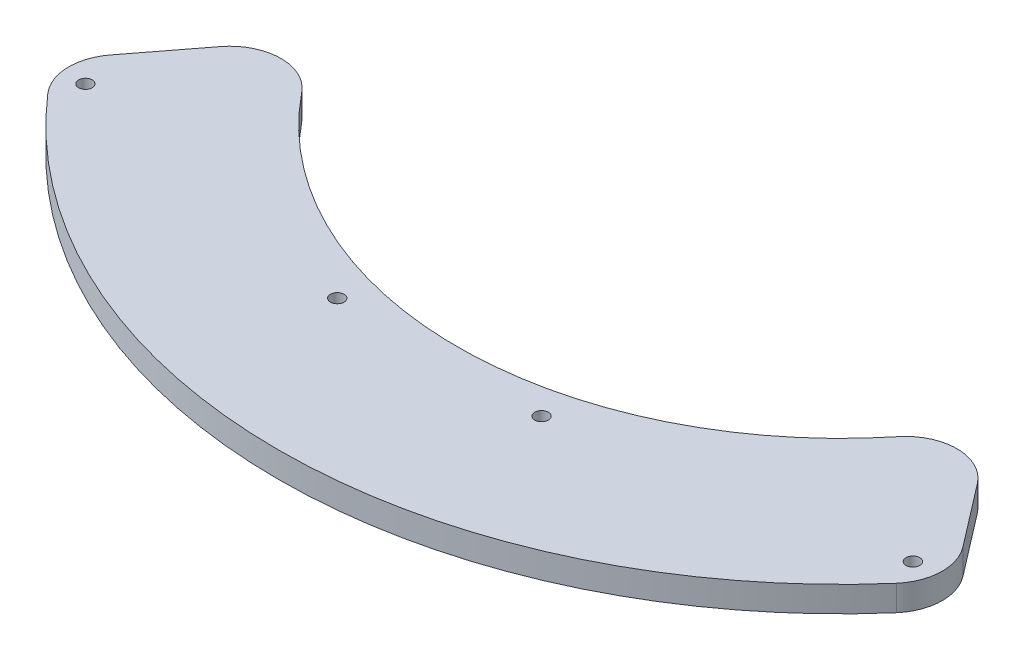
ISO-10303-21;
HEADER;
FILE_DESCRIPTION(('STEP AP214'),'2;1');
FILE_NAME('part.step','',(''),(''),'','','');
FILE_SCHEMA(('AUTOMOTIVE_DESIGN { 1 0 10303 214 1 1 1 1 }'));
ENDSEC;
DATA;
#1=APPLICATION_CONTEXT('core data for automotive mechanical design processes');
#2=APPLICATION_PROTOCOL_DEFINITION('international standard','automotive_design',2000,#1);
#3=PRODUCT_CONTEXT('',#1,'mechanical');
#4=PRODUCT('Part','Part','',(#3));
#5=PRODUCT_RELATED_PRODUCT_CATEGORY('part','',(#4));
#6=PRODUCT_DEFINITION_FORMATION('','',#4);
#7=PRODUCT_DEFINITION_CONTEXT('part definition',#1,'design');
#8=PRODUCT_DEFINITION('design','',#6,#7);
#9=PRODUCT_DEFINITION_SHAPE('','',#8);
#10=(LENGTH_UNIT() NAMED_UNIT(*) SI_UNIT(.MILLI.,.METRE.));
#11=(NAMED_UNIT(*) PLANE_ANGLE_UNIT() SI_UNIT($,.RADIAN.));
#12=(NAMED_UNIT(*) SI_UNIT($,.STERADIAN.) SOLID_ANGLE_UNIT());
#13=UNCERTAINTY_MEASURE_WITH_UNIT(LENGTH_MEASURE(1.E-05),#10,'distance_accuracy_value','');
#14=(GEOMETRIC_REPRESENTATION_CONTEXT(3) GLOBAL_UNCERTAINTY_ASSIGNED_CONTEXT((#13)) GLOBAL_UNIT_ASSIGNED_CONTEXT((#10,
#11,#12)) REPRESENTATION_CONTEXT('',''));
#15=CARTESIAN_POINT('',(0.,0.,0.));
#16=DIRECTION('',(0.,0.,1.));
#17=DIRECTION('',(1.,0.,0.));
#18=AXIS2_PLACEMENT_3D('',#15,#16,#17);
#19=CARTESIAN_POINT('',(84.021948487146,6.35,-34.47476750129));
#20=DIRECTION('',(0.,-1.,0.));
#21=DIRECTION('',(0.,0.,-1.));
#22=AXIS2_PLACEMENT_3D('',#19,#20,#21);
#23=PLANE('',#22);
#24=CARTESIAN_POINT('',(-102.87,6.35,-17.3975111104705));
#25=DIRECTION('',(0.,1.,0.));
#26=DIRECTION('',(0.,0.,-1.));
#27=AXIS2_PLACEMENT_3D('',#24,#25,#26);
#28=CIRCLE('',#27,1.70053000000001);
#29=CARTESIAN_POINT('',(-102.87,6.35,-19.0980411104705));
#30=VERTEX_POINT('',#29);
#31=EDGE_CURVE('E187',#30,#30,#28,.T.);
#32=ORIENTED_EDGE('',*,*,#31,.F.);
#33=EDGE_LOOP('',(#32));
#34=FACE_BOUND('',#33,.T.);
#35=CARTESIAN_POINT('',(102.87,6.35,-17.3975111104704));
#36=DIRECTION('',(0.,1.,0.));
#37=DIRECTION('',(0.,0.,1.));
#38=AXIS2_PLACEMENT_3D('',#35,#36,#37);
#39=CIRCLE('',#38,1.70053000000001);
#40=CARTESIAN_POINT('',(102.87,6.35,-15.6969811104704));
#41=VERTEX_POINT('',#40);
#42=EDGE_CURVE('E133',#41,#41,#39,.T.);
#43=ORIENTED_EDGE('',*,*,#42,.F.);
#44=EDGE_LOOP('',(#43));
#45=FACE_BOUND('',#44,.T.);
#46=CARTESIAN_POINT('',(84.021948487146,6.35,-34.47476750129));
#47=DIRECTION('',(0.,1.,0.));
#48=DIRECTION('',(0.,0.,-1.));
#49=AXIS2_PLACEMENT_3D('',#46,#47,#48);
#50=CIRCLE('',#49,12.7);
#51=CARTESIAN_POINT('',(94.0975359088447,6.35,-42.2060376497007));
#52=VERTEX_POINT('',#51);
#53=CARTESIAN_POINT('',(74.1370133710112,6.35,-42.4483525011382));
#54=VERTEX_POINT('',#53);
#55=EDGE_CURVE('E144',#52,#54,#50,.T.);
#56=ORIENTED_EDGE('',*,*,#55,.T.);
#57=CARTESIAN_POINT('',(0.,6.35,-102.25024));
#58=DIRECTION('',(0.,-1.,0.));
#59=DIRECTION('',(0.,0.,1.));
#60=AXIS2_PLACEMENT_3D('',#57,#58,#59);
#61=CIRCLE('',#60,95.25);
#62=CARTESIAN_POINT('',(-74.1370133710112,6.35,-42.4483525011384));
#63=VERTEX_POINT('',#62);
#64=EDGE_CURVE('E92',#54,#63,#61,.T.);
#65=ORIENTED_EDGE('',*,*,#64,.T.);
#66=CARTESIAN_POINT('',(-84.021948487146,6.35,-34.4747675012901));
#67=DIRECTION('',(0.,1.,0.));
#68=DIRECTION('',(0.,0.,1.));
#69=AXIS2_PLACEMENT_3D('',#66,#67,#68);
#70=CIRCLE('',#69,12.7);
#71=CARTESIAN_POINT('',(-94.0975359088447,6.35,-42.2060376497008));
#72=VERTEX_POINT('',#71);
#73=EDGE_CURVE('E159',#63,#72,#70,.T.);
#74=ORIENTED_EDGE('',*,*,#73,.T.);
#75=DIRECTION('',(-0.608761429008717,0.,0.793353340291238));
#76=VECTOR('',#75,1.);
#77=CARTESIAN_POINT('',(-105.977429973967,6.35,-26.7238582773672));
#78=LINE('',#77,#76);
#79=CARTESIAN_POINT('',(-105.977429973967,6.35,-26.7238582773672));
#80=VERTEX_POINT('',#79);
#81=EDGE_CURVE('E172',#72,#80,#78,.T.);
#82=ORIENTED_EDGE('',*,*,#81,.T.);
#83=CARTESIAN_POINT('',(-95.9018425522686,6.35,-18.9925881289565));
#84=DIRECTION('',(0.,1.,0.));
#85=DIRECTION('',(0.,0.,1.));
#86=AXIS2_PLACEMENT_3D('',#83,#84,#85);
#87=CIRCLE('',#86,12.7);
#88=CARTESIAN_POINT('',(-105.492026807495,6.35,-10.6668229418522));
#89=VERTEX_POINT('',#88);
#90=EDGE_CURVE('E111',#80,#89,#87,.T.);
#91=ORIENTED_EDGE('',*,*,#90,.T.);
#92=CARTESIAN_POINT('',(0.,6.35,-102.25024));
#93=DIRECTION('',(0.,1.,0.));
#94=DIRECTION('',(0.,0.,1.));
#95=AXIS2_PLACEMENT_3D('',#92,#93,#94);
#96=CIRCLE('',#95,139.7);
#97=CARTESIAN_POINT('',(105.492026807495,6.35,-10.666822941852));
#98=VERTEX_POINT('',#97);
#99=EDGE_CURVE('E105',#89,#98,#96,.T.);
#100=ORIENTED_EDGE('',*,*,#99,.T.);
#101=CARTESIAN_POINT('',(95.9018425522686,6.35,-18.9925881289563));
#102=DIRECTION('',(0.,1.,0.));
#103=DIRECTION('',(0.,0.,-1.));
#104=AXIS2_PLACEMENT_3D('',#101,#102,#103);
#105=CIRCLE('',#104,12.7);
#106=CARTESIAN_POINT('',(105.977429973967,6.35,-26.723858277367));
#107=VERTEX_POINT('',#106);
#108=EDGE_CURVE('E109',#98,#107,#105,.T.);
#109=ORIENTED_EDGE('',*,*,#108,.T.);
#110=DIRECTION('',(-0.608761429008716,0.,-0.793353340291238));
#111=VECTOR('',#110,1.);
#112=CARTESIAN_POINT('',(94.0975359088447,6.35,-42.2060376497007));
#113=LINE('',#112,#111);
#114=EDGE_CURVE('E49',#107,#52,#113,.T.);
#115=ORIENTED_EDGE('',*,*,#114,.T.);
#116=EDGE_LOOP('',(#56,#65,#74,#82,#91,#100,#109,#115));
#117=FACE_BOUND('',#116,.T.);
#118=CARTESIAN_POINT('',(25.4,6.35,-2.54));
#119=DIRECTION('',(0.,1.,0.));
#120=DIRECTION('',(0.,0.,1.));
#121=AXIS2_PLACEMENT_3D('',#118,#119,#120);
#122=CIRCLE('',#121,1.70053);
#123=CARTESIAN_POINT('',(25.4,6.35,-0.839469999999998));
#124=VERTEX_POINT('',#123);
#125=EDGE_CURVE('E181',#124,#124,#122,.T.);
#126=ORIENTED_EDGE('',*,*,#125,.F.);
#127=EDGE_LOOP('',(#126));
#128=FACE_BOUND('',#127,.T.);
#129=CARTESIAN_POINT('',(-25.4,6.35,-2.54000000000003));
#130=DIRECTION('',(0.,1.,0.));
#131=DIRECTION('',(0.,0.,-1.));
#132=AXIS2_PLACEMENT_3D('',#129,#130,#131);
#133=CIRCLE('',#132,1.70053);
#134=CARTESIAN_POINT('',(-25.4,6.35,-4.24053000000003));
#135=VERTEX_POINT('',#134);
#136=EDGE_CURVE('E193',#135,#135,#133,.T.);
#137=ORIENTED_EDGE('',*,*,#136,.F.);
#138=EDGE_LOOP('',(#137));
#139=FACE_BOUND('',#138,.T.);
#140=ADVANCED_FACE('F32',(#34,#45,#117,#128,#139),#23,.F.);
#141=CARTESIAN_POINT('',(84.021948487146,0.,-34.47476750129));
#142=DIRECTION('',(0.,-1.,0.));
#143=DIRECTION('',(0.,0.,-1.));
#144=AXIS2_PLACEMENT_3D('',#141,#142,#143);
#145=PLANE('',#144);
#146=CARTESIAN_POINT('',(-102.87,0.,-17.3975111104705));
#147=DIRECTION('',(0.,1.,0.));
#148=DIRECTION('',(0.,0.,-1.));
#149=AXIS2_PLACEMENT_3D('',#146,#147,#148);
#150=CIRCLE('',#149,1.70053000000001);
#151=CARTESIAN_POINT('',(-102.87,0.,-19.0980411104705));
#152=VERTEX_POINT('',#151);
#153=EDGE_CURVE('E190',#152,#152,#150,.T.);
#154=ORIENTED_EDGE('',*,*,#153,.T.);
#155=EDGE_LOOP('',(#154));
#156=FACE_BOUND('',#155,.T.);
#157=CARTESIAN_POINT('',(102.87,0.,-17.3975111104704));
#158=DIRECTION('',(0.,1.,0.));
#159=DIRECTION('',(0.,0.,1.));
#160=AXIS2_PLACEMENT_3D('',#157,#158,#159);
#161=CIRCLE('',#160,1.70053000000001);
#162=CARTESIAN_POINT('',(102.87,0.,-15.6969811104704));
#163=VERTEX_POINT('',#162);
#164=EDGE_CURVE('E178',#163,#163,#161,.T.);
#165=ORIENTED_EDGE('',*,*,#164,.T.);
#166=EDGE_LOOP('',(#165));
#167=FACE_BOUND('',#166,.T.);
#168=CARTESIAN_POINT('',(84.021948487146,0.,-34.47476750129));
#169=DIRECTION('',(0.,1.,0.));
#170=DIRECTION('',(0.,0.,-1.));
#171=AXIS2_PLACEMENT_3D('',#168,#169,#170);
#172=CIRCLE('',#171,12.7);
#173=CARTESIAN_POINT('',(94.0975359088447,0.,-42.2060376497007));
#174=VERTEX_POINT('',#173);
#175=CARTESIAN_POINT('',(74.1370133710112,0.,-42.4483525011382));
#176=VERTEX_POINT('',#175);
#177=EDGE_CURVE('E129',#174,#176,#172,.T.);
#178=ORIENTED_EDGE('',*,*,#177,.F.);
#179=DIRECTION('',(-0.608761429008716,0.,-0.793353340291238));
#180=VECTOR('',#179,1.);
#181=CARTESIAN_POINT('',(94.0975359088447,0.,-42.2060376497007));
#182=LINE('',#181,#180);
#183=CARTESIAN_POINT('',(105.977429973967,0.,-26.723858277367));
#184=VERTEX_POINT('',#183);
#185=EDGE_CURVE('E84',#184,#174,#182,.T.);
#186=ORIENTED_EDGE('',*,*,#185,.F.);
#187=CARTESIAN_POINT('',(95.9018425522686,0.,-18.9925881289563));
#188=DIRECTION('',(0.,1.,0.));
#189=DIRECTION('',(0.,0.,-1.));
#190=AXIS2_PLACEMENT_3D('',#187,#188,#189);
#191=CIRCLE('',#190,12.7);
#192=CARTESIAN_POINT('',(105.492026807495,0.,-10.666822941852));
#193=VERTEX_POINT('',#192);
#194=EDGE_CURVE('E78',#193,#184,#191,.T.);
#195=ORIENTED_EDGE('',*,*,#194,.F.);
#196=CARTESIAN_POINT('',(0.,0.,-102.25024));
#197=DIRECTION('',(0.,1.,0.));
#198=DIRECTION('',(0.,0.,1.));
#199=AXIS2_PLACEMENT_3D('',#196,#197,#198);
#200=CIRCLE('',#199,139.7);
#201=CARTESIAN_POINT('',(-105.492026807495,0.,-10.6668229418522));
#202=VERTEX_POINT('',#201);
#203=EDGE_CURVE('E119',#202,#193,#200,.T.);
#204=ORIENTED_EDGE('',*,*,#203,.F.);
#205=CARTESIAN_POINT('',(-95.9018425522686,0.,-18.9925881289565));
#206=DIRECTION('',(0.,1.,0.));
#207=DIRECTION('',(0.,0.,1.));
#208=AXIS2_PLACEMENT_3D('',#205,#206,#207);
#209=CIRCLE('',#208,12.7);
#210=CARTESIAN_POINT('',(-105.977429973967,0.,-26.7238582773672));
#211=VERTEX_POINT('',#210);
#212=EDGE_CURVE('E139',#211,#202,#209,.T.);
#213=ORIENTED_EDGE('',*,*,#212,.F.);
#214=DIRECTION('',(-0.608761429008717,0.,0.793353340291238));
#215=VECTOR('',#214,1.);
#216=CARTESIAN_POINT('',(-105.977429973967,0.,-26.7238582773672));
#217=LINE('',#216,#215);
#218=CARTESIAN_POINT('',(-94.0975359088447,0.,-42.2060376497008));
#219=VERTEX_POINT('',#218);
#220=EDGE_CURVE('E137',#219,#211,#217,.T.);
#221=ORIENTED_EDGE('',*,*,#220,.F.);
#222=CARTESIAN_POINT('',(-84.021948487146,0.,-34.4747675012901));
#223=DIRECTION('',(0.,1.,0.));
#224=DIRECTION('',(0.,0.,1.));
#225=AXIS2_PLACEMENT_3D('',#222,#223,#224);
#226=CIRCLE('',#225,12.7);
#227=CARTESIAN_POINT('',(-74.1370133710112,0.,-42.4483525011384));
#228=VERTEX_POINT('',#227);
#229=EDGE_CURVE('E135',#228,#219,#226,.T.);
#230=ORIENTED_EDGE('',*,*,#229,.F.);
#231=CARTESIAN_POINT('',(0.,0.,-102.25024));
#232=DIRECTION('',(0.,-1.,0.));
#233=DIRECTION('',(0.,0.,1.));
#234=AXIS2_PLACEMENT_3D('',#231,#232,#233);
#235=CIRCLE('',#234,95.25);
#236=EDGE_CURVE('E132',#176,#228,#235,.T.);
#237=ORIENTED_EDGE('',*,*,#236,.F.);
#238=EDGE_LOOP('',(#178,#186,#195,#204,#213,#221,#230,#237));
#239=FACE_BOUND('',#238,.T.);
#240=CARTESIAN_POINT('',(25.4,0.,-2.54));
#241=DIRECTION('',(0.,1.,0.));
#242=DIRECTION('',(0.,0.,1.));
#243=AXIS2_PLACEMENT_3D('',#240,#241,#242);
#244=CIRCLE('',#243,1.70053);
#245=CARTESIAN_POINT('',(25.4,0.,-0.839469999999998));
#246=VERTEX_POINT('',#245);
#247=EDGE_CURVE('E184',#246,#246,#244,.T.);
#248=ORIENTED_EDGE('',*,*,#247,.T.);
#249=EDGE_LOOP('',(#248));
#250=FACE_BOUND('',#249,.T.);
#251=CARTESIAN_POINT('',(-25.4,0.,-2.54000000000003));
#252=DIRECTION('',(0.,1.,0.));
#253=DIRECTION('',(0.,0.,-1.));
#254=AXIS2_PLACEMENT_3D('',#251,#252,#253);
#255=CIRCLE('',#254,1.70053);
#256=CARTESIAN_POINT('',(-25.4,0.,-4.24053000000003));
#257=VERTEX_POINT('',#256);
#258=EDGE_CURVE('E196',#257,#257,#255,.T.);
#259=ORIENTED_EDGE('',*,*,#258,.T.);
#260=EDGE_LOOP('',(#259));
#261=FACE_BOUND('',#260,.T.);
#262=ADVANCED_FACE('F163',(#156,#167,#239,#250,#261),#145,.T.);
#263=CARTESIAN_POINT('',(84.021948487146,6.35,-34.47476750129));
#264=DIRECTION('',(0.,-1.,0.));
#265=DIRECTION('',(0.,0.,-1.));
#266=AXIS2_PLACEMENT_3D('',#263,#264,#265);
#267=CYLINDRICAL_SURFACE('',#266,12.7);
#268=ORIENTED_EDGE('',*,*,#177,.T.);
#269=DIRECTION('',(0.,-1.,0.));
#270=VECTOR('',#269,1.);
#271=CARTESIAN_POINT('',(74.1370133710112,6.35,-42.4483525011382));
#272=LINE('',#271,#270);
#273=EDGE_CURVE('E11',#54,#176,#272,.T.);
#274=ORIENTED_EDGE('',*,*,#273,.F.);
#275=ORIENTED_EDGE('',*,*,#55,.F.);
#276=DIRECTION('',(0.,-1.,0.));
#277=VECTOR('',#276,1.);
#278=CARTESIAN_POINT('',(94.0975359088447,6.35,-42.2060376497007));
#279=LINE('',#278,#277);
#280=EDGE_CURVE('E125',#52,#174,#279,.T.);
#281=ORIENTED_EDGE('',*,*,#280,.T.);
#282=EDGE_LOOP('',(#268,#274,#275,#281));
#283=FACE_BOUND('',#282,.T.);
#284=ADVANCED_FACE('F34',(#283),#267,.T.);
#285=CARTESIAN_POINT('',(0.,6.35,-102.25024));
#286=DIRECTION('',(0.,-1.,0.));
#287=DIRECTION('',(0.,0.,-1.));
#288=AXIS2_PLACEMENT_3D('',#285,#286,#287);
#289=CYLINDRICAL_SURFACE('',#288,95.25);
#290=ORIENTED_EDGE('',*,*,#236,.T.);
#291=DIRECTION('',(0.,-1.,0.));
#292=VECTOR('',#291,1.);
#293=CARTESIAN_POINT('',(-74.1370133710112,6.35,-42.4483525011384));
#294=LINE('',#293,#292);
#295=EDGE_CURVE('E41',#63,#228,#294,.T.);
#296=ORIENTED_EDGE('',*,*,#295,.F.);
#297=ORIENTED_EDGE('',*,*,#64,.F.);
#298=ORIENTED_EDGE('',*,*,#273,.T.);
#299=EDGE_LOOP('',(#290,#296,#297,#298));
#300=FACE_BOUND('',#299,.T.);
#301=ADVANCED_FACE('F231',(#300),#289,.F.);
#302=CARTESIAN_POINT('',(-84.021948487146,6.35,-34.4747675012901));
#303=DIRECTION('',(0.,-1.,0.));
#304=DIRECTION('',(0.,0.,-1.));
#305=AXIS2_PLACEMENT_3D('',#302,#303,#304);
#306=CYLINDRICAL_SURFACE('',#305,12.7);
#307=ORIENTED_EDGE('',*,*,#229,.T.);
#308=DIRECTION('',(0.,-1.,0.));
#309=VECTOR('',#308,1.);
#310=CARTESIAN_POINT('',(-94.0975359088447,6.35,-42.2060376497008));
#311=LINE('',#310,#309);
#312=EDGE_CURVE('E151',#72,#219,#311,.T.);
#313=ORIENTED_EDGE('',*,*,#312,.F.);
#314=ORIENTED_EDGE('',*,*,#73,.F.);
#315=ORIENTED_EDGE('',*,*,#295,.T.);
#316=EDGE_LOOP('',(#307,#313,#314,#315));
#317=FACE_BOUND('',#316,.T.);
#318=ADVANCED_FACE('F157',(#317),#306,.T.);
#319=CARTESIAN_POINT('',(-105.977429973967,6.35,-26.7238582773672));
#320=DIRECTION('',(0.793353340291238,0.,0.608761429008717));
#321=DIRECTION('',(0.608761429008717,0.,-0.793353340291238));
#322=AXIS2_PLACEMENT_3D('',#319,#320,#321);
#323=PLANE('',#322);
#324=ORIENTED_EDGE('',*,*,#220,.T.);
#325=DIRECTION('',(0.,-1.,0.));
#326=VECTOR('',#325,1.);
#327=CARTESIAN_POINT('',(-105.977429973967,6.35,-26.7238582773672));
#328=LINE('',#327,#326);
#329=EDGE_CURVE('E148',#80,#211,#328,.T.);
#330=ORIENTED_EDGE('',*,*,#329,.F.);
#331=ORIENTED_EDGE('',*,*,#81,.F.);
#332=ORIENTED_EDGE('',*,*,#312,.T.);
#333=EDGE_LOOP('',(#324,#330,#331,#332));
#334=FACE_BOUND('',#333,.T.);
#335=ADVANCED_FACE('F168',(#334),#323,.F.);
#336=CARTESIAN_POINT('',(-95.9018425522686,6.35,-18.9925881289565));
#337=DIRECTION('',(0.,-1.,0.));
#338=DIRECTION('',(0.,0.,-1.));
#339=AXIS2_PLACEMENT_3D('',#336,#337,#338);
#340=CYLINDRICAL_SURFACE('',#339,12.7);
#341=ORIENTED_EDGE('',*,*,#212,.T.);
#342=DIRECTION('',(0.,-1.,0.));
#343=VECTOR('',#342,1.);
#344=CARTESIAN_POINT('',(-105.492026807495,6.35,-10.6668229418522));
#345=LINE('',#344,#343);
#346=EDGE_CURVE('E120',#89,#202,#345,.T.);
#347=ORIENTED_EDGE('',*,*,#346,.F.);
#348=ORIENTED_EDGE('',*,*,#90,.F.);
#349=ORIENTED_EDGE('',*,*,#329,.T.);
#350=EDGE_LOOP('',(#341,#347,#348,#349));
#351=FACE_BOUND('',#350,.T.);
#352=ADVANCED_FACE('F171',(#351),#340,.T.);
#353=CARTESIAN_POINT('',(0.,6.35,-102.25024));
#354=DIRECTION('',(0.,-1.,0.));
#355=DIRECTION('',(0.,0.,-1.));
#356=AXIS2_PLACEMENT_3D('',#353,#354,#355);
#357=CYLINDRICAL_SURFACE('',#356,139.7);
#358=ORIENTED_EDGE('',*,*,#203,.T.);
#359=DIRECTION('',(0.,-1.,0.));
#360=VECTOR('',#359,1.);
#361=CARTESIAN_POINT('',(105.492026807495,6.35,-10.666822941852));
#362=LINE('',#361,#360);
#363=EDGE_CURVE('E116',#98,#193,#362,.T.);
#364=ORIENTED_EDGE('',*,*,#363,.F.);
#365=ORIENTED_EDGE('',*,*,#99,.F.);
#366=ORIENTED_EDGE('',*,*,#346,.T.);
#367=EDGE_LOOP('',(#358,#364,#365,#366));
#368=FACE_BOUND('',#367,.T.);
#369=ADVANCED_FACE('F117',(#368),#357,.T.);
#370=CARTESIAN_POINT('',(95.9018425522686,6.35,-18.9925881289563));
#371=DIRECTION('',(0.,-1.,0.));
#372=DIRECTION('',(0.,0.,-1.));
#373=AXIS2_PLACEMENT_3D('',#370,#371,#372);
#374=CYLINDRICAL_SURFACE('',#373,12.7);
#375=ORIENTED_EDGE('',*,*,#194,.T.);
#376=DIRECTION('',(0.,-1.,0.));
#377=VECTOR('',#376,1.);
#378=CARTESIAN_POINT('',(105.977429973967,6.35,-26.723858277367));
#379=LINE('',#378,#377);
#380=EDGE_CURVE('E121',#107,#184,#379,.T.);
#381=ORIENTED_EDGE('',*,*,#380,.F.);
#382=ORIENTED_EDGE('',*,*,#108,.F.);
#383=ORIENTED_EDGE('',*,*,#363,.T.);
#384=EDGE_LOOP('',(#375,#381,#382,#383));
#385=FACE_BOUND('',#384,.T.);
#386=ADVANCED_FACE('F123',(#385),#374,.T.);
#387=CARTESIAN_POINT('',(94.0975359088447,6.35,-42.2060376497007));
#388=DIRECTION('',(-0.793353340291238,0.,0.608761429008716));
#389=DIRECTION('',(0.608761429008716,0.,0.793353340291238));
#390=AXIS2_PLACEMENT_3D('',#387,#388,#389);
#391=PLANE('',#390);
#392=ORIENTED_EDGE('',*,*,#185,.T.);
#393=ORIENTED_EDGE('',*,*,#280,.F.);
#394=ORIENTED_EDGE('',*,*,#114,.F.);
#395=ORIENTED_EDGE('',*,*,#380,.T.);
#396=EDGE_LOOP('',(#392,#393,#394,#395));
#397=FACE_BOUND('',#396,.T.);
#398=ADVANCED_FACE('F219',(#397),#391,.F.);
#399=CARTESIAN_POINT('',(102.87,6.35,-17.3975111104704));
#400=DIRECTION('',(0.,-1.,0.));
#401=DIRECTION('',(0.,0.,-1.));
#402=AXIS2_PLACEMENT_3D('',#399,#400,#401);
#403=CYLINDRICAL_SURFACE('',#402,1.70053000000001);
#404=ORIENTED_EDGE('',*,*,#42,.T.);
#405=EDGE_LOOP('',(#404));
#406=FACE_BOUND('',#405,.T.);
#407=ORIENTED_EDGE('',*,*,#164,.F.);
#408=EDGE_LOOP('',(#407));
#409=FACE_BOUND('',#408,.T.);
#410=ADVANCED_FACE('F216',(#406,#409),#403,.F.);
#411=CARTESIAN_POINT('',(25.4,6.35,-2.54));
#412=DIRECTION('',(0.,-1.,0.));
#413=DIRECTION('',(0.,0.,-1.));
#414=AXIS2_PLACEMENT_3D('',#411,#412,#413);
#415=CYLINDRICAL_SURFACE('',#414,1.70053);
#416=ORIENTED_EDGE('',*,*,#125,.T.);
#417=EDGE_LOOP('',(#416));
#418=FACE_BOUND('',#417,.T.);
#419=ORIENTED_EDGE('',*,*,#247,.F.);
#420=EDGE_LOOP('',(#419));
#421=FACE_BOUND('',#420,.T.);
#422=ADVANCED_FACE('F295',(#418,#421),#415,.F.);
#423=CARTESIAN_POINT('',(-102.87,6.35,-17.3975111104705));
#424=DIRECTION('',(0.,-1.,0.));
#425=DIRECTION('',(0.,0.,-1.));
#426=AXIS2_PLACEMENT_3D('',#423,#424,#425);
#427=CYLINDRICAL_SURFACE('',#426,1.70053000000001);
#428=ORIENTED_EDGE('',*,*,#31,.T.);
#429=EDGE_LOOP('',(#428));
#430=FACE_BOUND('',#429,.T.);
#431=ORIENTED_EDGE('',*,*,#153,.F.);
#432=EDGE_LOOP('',(#431));
#433=FACE_BOUND('',#432,.T.);
#434=ADVANCED_FACE('F303',(#430,#433),#427,.F.);
#435=CARTESIAN_POINT('',(-25.4,6.35,-2.54000000000003));
#436=DIRECTION('',(0.,-1.,0.));
#437=DIRECTION('',(0.,0.,-1.));
#438=AXIS2_PLACEMENT_3D('',#435,#436,#437);
#439=CYLINDRICAL_SURFACE('',#438,1.70053);
#440=ORIENTED_EDGE('',*,*,#136,.T.);
#441=EDGE_LOOP('',(#440));
#442=FACE_BOUND('',#441,.T.);
#443=ORIENTED_EDGE('',*,*,#258,.F.);
#444=EDGE_LOOP('',(#443));
#445=FACE_BOUND('',#444,.T.);
#446=ADVANCED_FACE('F202',(#442,#445),#439,.F.);
#447=CLOSED_SHELL('',(#140,#262,#284,#301,#318,#335,#352,#369,#386,#398,#410,#422,#434,#446));
#448=MANIFOLD_SOLID_BREP('B2',#447);
#449=ADVANCED_BREP_SHAPE_REPRESENTATION('',(#18,#448),#14);
#450=SHAPE_DEFINITION_REPRESENTATION(#9,#449);
ENDSEC;
END-ISO-10303-21;
